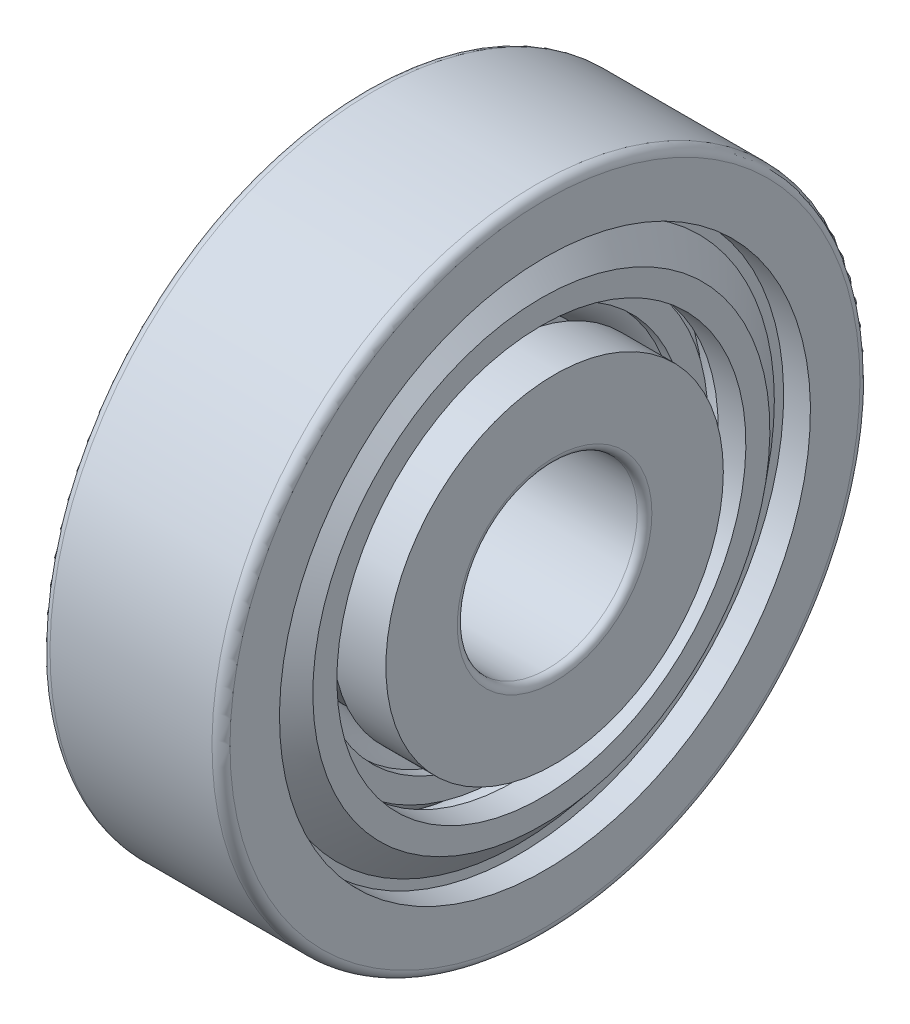
ISO-10303-21;
HEADER;
FILE_DESCRIPTION(('STEP AP214'),'2;1');
FILE_NAME('part.step','',(''),(''),'','','');
FILE_SCHEMA(('AUTOMOTIVE_DESIGN { 1 0 10303 214 1 1 1 1 }'));
ENDSEC;
DATA;
#1=APPLICATION_CONTEXT('core data for automotive mechanical design processes');
#2=APPLICATION_PROTOCOL_DEFINITION('international standard','automotive_design',2000,#1);
#3=PRODUCT_CONTEXT('',#1,'mechanical');
#4=PRODUCT('Part','Part','',(#3));
#5=PRODUCT_RELATED_PRODUCT_CATEGORY('part','',(#4));
#6=PRODUCT_DEFINITION_FORMATION('','',#4);
#7=PRODUCT_DEFINITION_CONTEXT('part definition',#1,'design');
#8=PRODUCT_DEFINITION('design','',#6,#7);
#9=PRODUCT_DEFINITION_SHAPE('','',#8);
#10=(LENGTH_UNIT() NAMED_UNIT(*) SI_UNIT(.MILLI.,.METRE.));
#11=(NAMED_UNIT(*) PLANE_ANGLE_UNIT() SI_UNIT($,.RADIAN.));
#12=(NAMED_UNIT(*) SI_UNIT($,.STERADIAN.) SOLID_ANGLE_UNIT());
#13=UNCERTAINTY_MEASURE_WITH_UNIT(LENGTH_MEASURE(1.E-05),#10,'distance_accuracy_value','');
#14=(GEOMETRIC_REPRESENTATION_CONTEXT(3) GLOBAL_UNCERTAINTY_ASSIGNED_CONTEXT((#13)) GLOBAL_UNIT_ASSIGNED_CONTEXT((#10,
#11,#12)) REPRESENTATION_CONTEXT('',''));
#15=CARTESIAN_POINT('',(0.,0.,0.));
#16=DIRECTION('',(0.,0.,1.));
#17=DIRECTION('',(1.,0.,0.));
#18=AXIS2_PLACEMENT_3D('',#15,#16,#17);
#19=CARTESIAN_POINT('',(0.,0.,0.));
#20=DIRECTION('',(1.,0.,0.));
#21=DIRECTION('',(0.,0.,-1.));
#22=AXIS2_PLACEMENT_3D('',#19,#20,#21);
#23=TOROIDAL_SURFACE('',#22,10.31875,1.984375);
#24=CARTESIAN_POINT('',(1.8929731022039,0.,0.));
#25=DIRECTION('',(1.,0.,0.));
#26=DIRECTION('',(0.,0.,-1.));
#27=AXIS2_PLACEMENT_3D('',#24,#25,#26);
#28=CIRCLE('',#27,9.72343749806714);
#29=CARTESIAN_POINT('',(1.8929731022039,0.,-9.72343749806714));
#30=VERTEX_POINT('',#29);
#31=EDGE_CURVE('E11',#30,#30,#28,.T.);
#32=ORIENTED_EDGE('',*,*,#31,.T.);
#33=EDGE_LOOP('',(#32));
#34=FACE_BOUND('',#33,.T.);
#35=CARTESIAN_POINT('',(-1.89297310341961,0.,0.));
#36=DIRECTION('',(1.,0.,0.));
#37=DIRECTION('',(0.,0.,-1.));
#38=AXIS2_PLACEMENT_3D('',#35,#36,#37);
#39=CIRCLE('',#38,9.72343750193286);
#40=CARTESIAN_POINT('',(-1.89297310341961,0.,-9.72343750193286));
#41=VERTEX_POINT('',#40);
#42=EDGE_CURVE('E70',#41,#41,#39,.T.);
#43=ORIENTED_EDGE('',*,*,#42,.F.);
#44=EDGE_LOOP('',(#43));
#45=FACE_BOUND('',#44,.T.);
#46=ADVANCED_FACE('F42',(#34,#45),#23,.T.);
#47=CARTESIAN_POINT('',(-2.48046875,0.,0.));
#48=DIRECTION('',(1.,0.,0.));
#49=DIRECTION('',(0.,0.,-1.));
#50=AXIS2_PLACEMENT_3D('',#47,#48,#49);
#51=CYLINDRICAL_SURFACE('',#50,9.72343750201236);
#52=CARTESIAN_POINT('',(2.48046874939214,0.,0.));
#53=DIRECTION('',(1.,0.,0.));
#54=DIRECTION('',(0.,0.,-1.));
#55=AXIS2_PLACEMENT_3D('',#52,#53,#54);
#56=CIRCLE('',#55,9.72343750595758);
#57=CARTESIAN_POINT('',(2.48046874939214,0.,-9.72343750595758));
#58=VERTEX_POINT('',#57);
#59=EDGE_CURVE('E48',#58,#58,#56,.T.);
#60=ORIENTED_EDGE('',*,*,#59,.T.);
#61=EDGE_LOOP('',(#60));
#62=FACE_BOUND('',#61,.T.);
#63=ORIENTED_EDGE('',*,*,#31,.F.);
#64=EDGE_LOOP('',(#63));
#65=FACE_BOUND('',#64,.T.);
#66=ADVANCED_FACE('F78',(#62,#65),#51,.F.);
#67=CARTESIAN_POINT('',(2.48046874939214,9.72343750595758,0.));
#68=DIRECTION('',(1.,0.,0.));
#69=DIRECTION('',(0.,0.,-1.));
#70=AXIS2_PLACEMENT_3D('',#67,#68,#69);
#71=PLANE('',#70);
#72=CARTESIAN_POINT('',(2.48046874939214,0.,0.));
#73=DIRECTION('',(1.,0.,0.));
#74=DIRECTION('',(0.,0.,-1.));
#75=AXIS2_PLACEMENT_3D('',#72,#73,#74);
#76=CIRCLE('',#75,10.9140625061487);
#77=CARTESIAN_POINT('',(2.48046874939214,0.,-10.9140625061487));
#78=VERTEX_POINT('',#77);
#79=EDGE_CURVE('E52',#78,#78,#76,.T.);
#80=ORIENTED_EDGE('',*,*,#79,.T.);
#81=EDGE_LOOP('',(#80));
#82=FACE_BOUND('',#81,.T.);
#83=ORIENTED_EDGE('',*,*,#59,.F.);
#84=EDGE_LOOP('',(#83));
#85=FACE_BOUND('',#84,.T.);
#86=ADVANCED_FACE('F82',(#82,#85),#71,.T.);
#87=CARTESIAN_POINT('',(-2.48046875,0.,0.));
#88=DIRECTION('',(1.,0.,0.));
#89=DIRECTION('',(0.,0.,-1.));
#90=AXIS2_PLACEMENT_3D('',#87,#88,#89);
#91=CYLINDRICAL_SURFACE('',#90,10.9140625051028);
#92=CARTESIAN_POINT('',(1.8929731022039,0.,0.));
#93=DIRECTION('',(1.,0.,0.));
#94=DIRECTION('',(0.,0.,-1.));
#95=AXIS2_PLACEMENT_3D('',#92,#93,#94);
#96=CIRCLE('',#95,10.9140625040569);
#97=CARTESIAN_POINT('',(1.8929731022039,0.,-10.9140625040569));
#98=VERTEX_POINT('',#97);
#99=EDGE_CURVE('E56',#98,#98,#96,.T.);
#100=ORIENTED_EDGE('',*,*,#99,.T.);
#101=EDGE_LOOP('',(#100));
#102=FACE_BOUND('',#101,.T.);
#103=ORIENTED_EDGE('',*,*,#79,.F.);
#104=EDGE_LOOP('',(#103));
#105=FACE_BOUND('',#104,.T.);
#106=ADVANCED_FACE('F86',(#102,#105),#91,.T.);
#107=CARTESIAN_POINT('',(0.,0.,0.));
#108=DIRECTION('',(1.,0.,0.));
#109=DIRECTION('',(0.,0.,-1.));
#110=AXIS2_PLACEMENT_3D('',#107,#108,#109);
#111=TOROIDAL_SURFACE('',#110,10.31875,1.98437500063721);
#112=CARTESIAN_POINT('',(-1.89297310341961,0.,0.));
#113=DIRECTION('',(1.,0.,0.));
#114=DIRECTION('',(0.,0.,-1.));
#115=AXIS2_PLACEMENT_3D('',#112,#113,#114);
#116=CIRCLE('',#115,10.9140625001912);
#117=CARTESIAN_POINT('',(-1.89297310341961,0.,-10.9140625001912));
#118=VERTEX_POINT('',#117);
#119=EDGE_CURVE('E61',#118,#118,#116,.T.);
#120=ORIENTED_EDGE('',*,*,#119,.T.);
#121=EDGE_LOOP('',(#120));
#122=FACE_BOUND('',#121,.T.);
#123=ORIENTED_EDGE('',*,*,#99,.F.);
#124=EDGE_LOOP('',(#123));
#125=FACE_BOUND('',#124,.T.);
#126=ADVANCED_FACE('F93',(#122,#125),#111,.T.);
#127=CARTESIAN_POINT('',(-2.48046875,0.,0.));
#128=DIRECTION('',(1.,0.,0.));
#129=DIRECTION('',(0.,0.,-1.));
#130=AXIS2_PLACEMENT_3D('',#127,#128,#129);
#131=CYLINDRICAL_SURFACE('',#130,10.9140625001912);
#132=CARTESIAN_POINT('',(-2.48046875060786,0.,0.));
#133=DIRECTION('',(1.,0.,0.));
#134=DIRECTION('',(0.,0.,-1.));
#135=AXIS2_PLACEMENT_3D('',#132,#133,#134);
#136=CIRCLE('',#135,10.9140625001912);
#137=CARTESIAN_POINT('',(-2.48046875060786,0.,-10.9140625001912));
#138=VERTEX_POINT('',#137);
#139=EDGE_CURVE('E64',#138,#138,#136,.T.);
#140=ORIENTED_EDGE('',*,*,#139,.T.);
#141=EDGE_LOOP('',(#140));
#142=FACE_BOUND('',#141,.T.);
#143=ORIENTED_EDGE('',*,*,#119,.F.);
#144=EDGE_LOOP('',(#143));
#145=FACE_BOUND('',#144,.T.);
#146=ADVANCED_FACE('F97',(#142,#145),#131,.T.);
#147=CARTESIAN_POINT('',(-2.48046875060786,10.9140625001912,0.));
#148=DIRECTION('',(-1.,0.,0.));
#149=DIRECTION('',(0.,0.,1.));
#150=AXIS2_PLACEMENT_3D('',#147,#148,#149);
#151=PLANE('',#150);
#152=CARTESIAN_POINT('',(-2.48046875060786,0.,0.));
#153=DIRECTION('',(1.,0.,0.));
#154=DIRECTION('',(0.,0.,-1.));
#155=AXIS2_PLACEMENT_3D('',#152,#153,#154);
#156=CIRCLE('',#155,9.7234375);
#157=CARTESIAN_POINT('',(-2.48046875060786,0.,-9.7234375));
#158=VERTEX_POINT('',#157);
#159=EDGE_CURVE('E67',#158,#158,#156,.T.);
#160=ORIENTED_EDGE('',*,*,#159,.T.);
#161=EDGE_LOOP('',(#160));
#162=FACE_BOUND('',#161,.T.);
#163=ORIENTED_EDGE('',*,*,#139,.F.);
#164=EDGE_LOOP('',(#163));
#165=FACE_BOUND('',#164,.T.);
#166=ADVANCED_FACE('F101',(#162,#165),#151,.T.);
#167=CARTESIAN_POINT('',(-2.48046875,0.,0.));
#168=DIRECTION('',(1.,0.,0.));
#169=DIRECTION('',(0.,0.,-1.));
#170=AXIS2_PLACEMENT_3D('',#167,#168,#169);
#171=CYLINDRICAL_SURFACE('',#170,9.72343750096643);
#172=ORIENTED_EDGE('',*,*,#42,.T.);
#173=EDGE_LOOP('',(#172));
#174=FACE_BOUND('',#173,.T.);
#175=ORIENTED_EDGE('',*,*,#159,.F.);
#176=EDGE_LOOP('',(#175));
#177=FACE_BOUND('',#176,.T.);
#178=ADVANCED_FACE('F74',(#174,#177),#171,.F.);
#179=CLOSED_SHELL('',(#46,#66,#86,#106,#126,#146,#166,#178));
#180=MANIFOLD_SOLID_BREP('B2',#179);
#181=CARTESIAN_POINT('',(0.508661040394074,0.,0.));
#182=DIRECTION('',(1.,0.,0.));
#183=DIRECTION('',(0.,0.,-1.));
#184=AXIS2_PLACEMENT_3D('',#181,#182,#183);
#185=TOROIDAL_SURFACE('',#184,10.3655627851351,2.402165314023);
#186=CARTESIAN_POINT('',(-1.41712720378895,0.,0.));
#187=DIRECTION('',(1.,0.,0.));
#188=DIRECTION('',(0.,0.,-1.));
#189=AXIS2_PLACEMENT_3D('',#186,#187,#188);
#190=CIRCLE('',#189,8.9296875);
#191=CARTESIAN_POINT('',(-1.41712720378895,0.,-8.9296875));
#192=VERTEX_POINT('',#191);
#193=EDGE_CURVE('E199',#192,#192,#190,.T.);
#194=ORIENTED_EDGE('',*,*,#193,.T.);
#195=EDGE_LOOP('',(#194));
#196=FACE_BOUND('',#195,.T.);
#197=CARTESIAN_POINT('',(2.43444928457709,0.,0.));
#198=DIRECTION('',(1.,0.,0.));
#199=DIRECTION('',(0.,0.,-1.));
#200=AXIS2_PLACEMENT_3D('',#197,#198,#199);
#201=CIRCLE('',#200,8.9296875);
#202=CARTESIAN_POINT('',(2.43444928457709,0.,-8.9296875));
#203=VERTEX_POINT('',#202);
#204=EDGE_CURVE('E41',#203,#203,#201,.T.);
#205=ORIENTED_EDGE('',*,*,#204,.F.);
#206=EDGE_LOOP('',(#205));
#207=FACE_BOUND('',#206,.T.);
#208=ADVANCED_FACE('F171',(#196,#207),#185,.F.);
#209=CARTESIAN_POINT('',(-3.96875,0.,0.));
#210=DIRECTION('',(1.,0.,0.));
#211=DIRECTION('',(0.,0.,-1.));
#212=AXIS2_PLACEMENT_3D('',#209,#210,#211);
#213=CYLINDRICAL_SURFACE('',#212,8.9296875);
#214=ORIENTED_EDGE('',*,*,#204,.T.);
#215=EDGE_LOOP('',(#214));
#216=FACE_BOUND('',#215,.T.);
#217=CARTESIAN_POINT('',(5.27116105629962,0.,0.));
#218=DIRECTION('',(1.,0.,0.));
#219=DIRECTION('',(0.,0.,-1.));
#220=AXIS2_PLACEMENT_3D('',#217,#218,#219);
#221=CIRCLE('',#220,8.9296875);
#222=CARTESIAN_POINT('',(5.27116105629962,0.,-8.9296875));
#223=VERTEX_POINT('',#222);
#224=EDGE_CURVE('E177',#223,#223,#221,.T.);
#225=ORIENTED_EDGE('',*,*,#224,.F.);
#226=EDGE_LOOP('',(#225));
#227=FACE_BOUND('',#226,.T.);
#228=ADVANCED_FACE('F217',(#216,#227),#213,.T.);
#229=CARTESIAN_POINT('',(5.27146997295227,0.,0.));
#230=DIRECTION('',(-1.,0.,0.));
#231=DIRECTION('',(0.,0.,1.));
#232=AXIS2_PLACEMENT_3D('',#229,#230,#231);
#233=CONICAL_SURFACE('',#232,5.14988165741046,1.57071459861498);
#234=ORIENTED_EDGE('',*,*,#224,.T.);
#235=EDGE_LOOP('',(#234));
#236=FACE_BOUND('',#235,.T.);
#237=CARTESIAN_POINT('',(5.27146997295227,0.,0.));
#238=DIRECTION('',(1.,0.,0.));
#239=DIRECTION('',(0.,0.,-1.));
#240=AXIS2_PLACEMENT_3D('',#237,#238,#239);
#241=CIRCLE('',#240,5.14988165741046);
#242=CARTESIAN_POINT('',(5.27146997295227,0.,-5.14988165741046));
#243=VERTEX_POINT('',#242);
#244=EDGE_CURVE('E181',#243,#243,#241,.T.);
#245=ORIENTED_EDGE('',*,*,#244,.F.);
#246=EDGE_LOOP('',(#245));
#247=FACE_BOUND('',#246,.T.);
#248=ADVANCED_FACE('F221',(#236,#247),#233,.T.);
#249=CARTESIAN_POINT('',(4.88411997424593,0.,0.));
#250=DIRECTION('',(1.,0.,0.));
#251=DIRECTION('',(0.,0.,-1.));
#252=AXIS2_PLACEMENT_3D('',#249,#250,#251);
#253=TOROIDAL_SURFACE('',#252,5.14985,0.38735);
#254=ORIENTED_EDGE('',*,*,#244,.T.);
#255=EDGE_LOOP('',(#254));
#256=FACE_BOUND('',#255,.T.);
#257=CARTESIAN_POINT('',(4.88411997424593,0.,0.));
#258=DIRECTION('',(1.,0.,0.));
#259=DIRECTION('',(0.,0.,-1.));
#260=AXIS2_PLACEMENT_3D('',#257,#258,#259);
#261=CIRCLE('',#260,4.7625);
#262=CARTESIAN_POINT('',(4.88411997424593,0.,-4.7625));
#263=VERTEX_POINT('',#262);
#264=EDGE_CURVE('E185',#263,#263,#261,.T.);
#265=ORIENTED_EDGE('',*,*,#264,.F.);
#266=EDGE_LOOP('',(#265));
#267=FACE_BOUND('',#266,.T.);
#268=ADVANCED_FACE('F225',(#256,#267),#253,.T.);
#269=CARTESIAN_POINT('',(-3.96875,0.,0.));
#270=DIRECTION('',(1.,0.,0.));
#271=DIRECTION('',(0.,0.,-1.));
#272=AXIS2_PLACEMENT_3D('',#269,#270,#271);
#273=CYLINDRICAL_SURFACE('',#272,4.7625);
#274=ORIENTED_EDGE('',*,*,#264,.T.);
#275=EDGE_LOOP('',(#274));
#276=FACE_BOUND('',#275,.T.);
#277=CARTESIAN_POINT('',(-3.85665583340697,0.,0.));
#278=DIRECTION('',(1.,0.,0.));
#279=DIRECTION('',(0.,0.,-1.));
#280=AXIS2_PLACEMENT_3D('',#277,#278,#279);
#281=CIRCLE('',#280,4.7625);
#282=CARTESIAN_POINT('',(-3.85665583340697,0.,-4.7625));
#283=VERTEX_POINT('',#282);
#284=EDGE_CURVE('E190',#283,#283,#281,.T.);
#285=ORIENTED_EDGE('',*,*,#284,.F.);
#286=EDGE_LOOP('',(#285));
#287=FACE_BOUND('',#286,.T.);
#288=ADVANCED_FACE('F231',(#276,#287),#273,.F.);
#289=CARTESIAN_POINT('',(-3.85665583340697,0.,0.));
#290=DIRECTION('',(1.,0.,0.));
#291=DIRECTION('',(0.,0.,-1.));
#292=AXIS2_PLACEMENT_3D('',#289,#290,#291);
#293=TOROIDAL_SURFACE('',#292,5.159375,0.396875);
#294=ORIENTED_EDGE('',*,*,#284,.T.);
#295=EDGE_LOOP('',(#294));
#296=FACE_BOUND('',#295,.T.);
#297=CARTESIAN_POINT('',(-4.25353083208151,0.,0.));
#298=DIRECTION('',(1.,0.,0.));
#299=DIRECTION('',(0.,0.,-1.));
#300=AXIS2_PLACEMENT_3D('',#297,#298,#299);
#301=CIRCLE('',#300,5.15934256412863);
#302=CARTESIAN_POINT('',(-4.25353083208151,0.,-5.15934256412863));
#303=VERTEX_POINT('',#302);
#304=EDGE_CURVE('E193',#303,#303,#301,.T.);
#305=ORIENTED_EDGE('',*,*,#304,.F.);
#306=EDGE_LOOP('',(#305));
#307=FACE_BOUND('',#306,.T.);
#308=ADVANCED_FACE('F213',(#296,#307),#293,.T.);
#309=CARTESIAN_POINT('',(-4.25383897551148,0.,0.));
#310=DIRECTION('',(-1.,0.,0.));
#311=DIRECTION('',(0.,0.,1.));
#312=AXIS2_PLACEMENT_3D('',#309,#310,#311);
#313=CONICAL_SURFACE('',#312,8.9296875,1.57071459861498);
#314=ORIENTED_EDGE('',*,*,#304,.T.);
#315=EDGE_LOOP('',(#314));
#316=FACE_BOUND('',#315,.T.);
#317=CARTESIAN_POINT('',(-4.25383897551148,0.,0.));
#318=DIRECTION('',(1.,0.,0.));
#319=DIRECTION('',(0.,0.,-1.));
#320=AXIS2_PLACEMENT_3D('',#317,#318,#319);
#321=CIRCLE('',#320,8.9296875);
#322=CARTESIAN_POINT('',(-4.25383897551148,0.,-8.9296875));
#323=VERTEX_POINT('',#322);
#324=EDGE_CURVE('E196',#323,#323,#321,.T.);
#325=ORIENTED_EDGE('',*,*,#324,.F.);
#326=EDGE_LOOP('',(#325));
#327=FACE_BOUND('',#326,.T.);
#328=ADVANCED_FACE('F207',(#316,#327),#313,.F.);
#329=CARTESIAN_POINT('',(-3.96875,0.,0.));
#330=DIRECTION('',(1.,0.,0.));
#331=DIRECTION('',(0.,0.,-1.));
#332=AXIS2_PLACEMENT_3D('',#329,#330,#331);
#333=CYLINDRICAL_SURFACE('',#332,8.9296875);
#334=ORIENTED_EDGE('',*,*,#324,.T.);
#335=EDGE_LOOP('',(#334));
#336=FACE_BOUND('',#335,.T.);
#337=ORIENTED_EDGE('',*,*,#193,.F.);
#338=EDGE_LOOP('',(#337));
#339=FACE_BOUND('',#338,.T.);
#340=ADVANCED_FACE('F205',(#336,#339),#333,.T.);
#341=CLOSED_SHELL('',(#208,#228,#248,#268,#288,#308,#328,#340));
#342=MANIFOLD_SOLID_BREP('B6',#341);
#343=CARTESIAN_POINT('',(0.,0.,0.));
#344=DIRECTION('',(1.,0.,0.));
#345=DIRECTION('',(0.,1.,0.));
#346=AXIS2_PLACEMENT_3D('',#343,#344,#345);
#347=TOROIDAL_SURFACE('',#346,12.3825,2.38124999999999);
#348=CARTESIAN_POINT('',(1.70055264454674,0.,0.));
#349=DIRECTION('',(1.,0.,0.));
#350=DIRECTION('',(0.,1.,0.));
#351=AXIS2_PLACEMENT_3D('',#348,#349,#350);
#352=CIRCLE('',#351,14.049375);
#353=CARTESIAN_POINT('',(1.70055264454674,14.049375,0.));
#354=VERTEX_POINT('',#353);
#355=EDGE_CURVE('E357',#354,#354,#352,.T.);
#356=ORIENTED_EDGE('',*,*,#355,.T.);
#357=EDGE_LOOP('',(#356));
#358=FACE_BOUND('',#357,.T.);
#359=CARTESIAN_POINT('',(-1.70055264454674,0.,0.));
#360=DIRECTION('',(1.,0.,0.));
#361=DIRECTION('',(0.,1.,0.));
#362=AXIS2_PLACEMENT_3D('',#359,#360,#361);
#363=CIRCLE('',#362,14.049375);
#364=CARTESIAN_POINT('',(-1.70055264454674,14.049375,0.));
#365=VERTEX_POINT('',#364);
#366=EDGE_CURVE('E170',#365,#365,#363,.T.);
#367=ORIENTED_EDGE('',*,*,#366,.F.);
#368=EDGE_LOOP('',(#367));
#369=FACE_BOUND('',#368,.T.);
#370=ADVANCED_FACE('F293',(#358,#369),#347,.F.);
#371=CARTESIAN_POINT('',(-4.7625,0.,0.));
#372=DIRECTION('',(1.,0.,0.));
#373=DIRECTION('',(0.,1.,0.));
#374=AXIS2_PLACEMENT_3D('',#371,#372,#373);
#375=CYLINDRICAL_SURFACE('',#374,14.049375);
#376=ORIENTED_EDGE('',*,*,#366,.T.);
#377=EDGE_LOOP('',(#376));
#378=FACE_BOUND('',#377,.T.);
#379=CARTESIAN_POINT('',(-3.10524361881795,0.,0.));
#380=DIRECTION('',(1.,0.,0.));
#381=DIRECTION('',(0.,1.,0.));
#382=AXIS2_PLACEMENT_3D('',#379,#380,#381);
#383=CIRCLE('',#382,14.049375);
#384=CARTESIAN_POINT('',(-3.10524361881795,14.049375,0.));
#385=VERTEX_POINT('',#384);
#386=EDGE_CURVE('E299',#385,#385,#383,.T.);
#387=ORIENTED_EDGE('',*,*,#386,.F.);
#388=EDGE_LOOP('',(#387));
#389=FACE_BOUND('',#388,.T.);
#390=ADVANCED_FACE('F375',(#378,#389),#375,.F.);
#391=CARTESIAN_POINT('',(-3.10524361881795,10.82278125,0.));
#392=DIRECTION('',(1.,0.,0.));
#393=DIRECTION('',(0.,1.,0.));
#394=AXIS2_PLACEMENT_3D('',#391,#392,#393);
#395=PLANE('',#394);
#396=ORIENTED_EDGE('',*,*,#386,.T.);
#397=EDGE_LOOP('',(#396));
#398=FACE_BOUND('',#397,.T.);
#399=CARTESIAN_POINT('',(-3.10524361881795,0.,0.));
#400=DIRECTION('',(1.,0.,0.));
#401=DIRECTION('',(0.,1.,0.));
#402=AXIS2_PLACEMENT_3D('',#399,#400,#401);
#403=CIRCLE('',#402,10.82278125);
#404=CARTESIAN_POINT('',(-3.10524361881795,10.82278125,0.));
#405=VERTEX_POINT('',#404);
#406=EDGE_CURVE('E303',#405,#405,#403,.T.);
#407=ORIENTED_EDGE('',*,*,#406,.F.);
#408=EDGE_LOOP('',(#407));
#409=FACE_BOUND('',#408,.T.);
#410=ADVANCED_FACE('F379',(#398,#409),#395,.T.);
#411=CARTESIAN_POINT('',(-4.7625,0.,0.));
#412=DIRECTION('',(1.,0.,0.));
#413=DIRECTION('',(0.,1.,0.));
#414=AXIS2_PLACEMENT_3D('',#411,#412,#413);
#415=CYLINDRICAL_SURFACE('',#414,10.82278125);
#416=ORIENTED_EDGE('',*,*,#406,.T.);
#417=EDGE_LOOP('',(#416));
#418=FACE_BOUND('',#417,.T.);
#419=CARTESIAN_POINT('',(-4.57200000000087,0.,0.));
#420=DIRECTION('',(1.,0.,0.));
#421=DIRECTION('',(0.,1.,0.));
#422=AXIS2_PLACEMENT_3D('',#419,#420,#421);
#423=CIRCLE('',#422,10.82278125);
#424=CARTESIAN_POINT('',(-4.57200000000087,10.82278125,0.));
#425=VERTEX_POINT('',#424);
#426=EDGE_CURVE('E307',#425,#425,#423,.T.);
#427=ORIENTED_EDGE('',*,*,#426,.F.);
#428=EDGE_LOOP('',(#427));
#429=FACE_BOUND('',#428,.T.);
#430=ADVANCED_FACE('F383',(#418,#429),#415,.F.);
#431=CARTESIAN_POINT('',(-4.57200000000087,12.0934210124996,0.));
#432=DIRECTION('',(-1.,0.,0.));
#433=DIRECTION('',(0.,-1.,0.));
#434=AXIS2_PLACEMENT_3D('',#431,#432,#433);
#435=PLANE('',#434);
#436=ORIENTED_EDGE('',*,*,#426,.T.);
#437=EDGE_LOOP('',(#436));
#438=FACE_BOUND('',#437,.T.);
#439=CARTESIAN_POINT('',(-4.57200000000087,0.,0.));
#440=DIRECTION('',(1.,0.,0.));
#441=DIRECTION('',(0.,1.,0.));
#442=AXIS2_PLACEMENT_3D('',#439,#440,#441);
#443=CIRCLE('',#442,12.0934210124996);
#444=CARTESIAN_POINT('',(-4.57200000000087,12.0934210124996,0.));
#445=VERTEX_POINT('',#444);
#446=EDGE_CURVE('E312',#445,#445,#443,.T.);
#447=ORIENTED_EDGE('',*,*,#446,.F.);
#448=EDGE_LOOP('',(#447));
#449=FACE_BOUND('',#448,.T.);
#450=ADVANCED_FACE('F389',(#438,#449),#435,.T.);
#451=CARTESIAN_POINT('',(-3.34336861881708,0.,0.));
#452=DIRECTION('',(1.,0.,0.));
#453=DIRECTION('',(0.,1.,0.));
#454=AXIS2_PLACEMENT_3D('',#451,#452,#453);
#455=CONICAL_SURFACE('',#454,13.5576468749989,0.872664625997);
#456=ORIENTED_EDGE('',*,*,#446,.T.);
#457=EDGE_LOOP('',(#456));
#458=FACE_BOUND('',#457,.T.);
#459=CARTESIAN_POINT('',(-3.34336861881708,0.,0.));
#460=DIRECTION('',(1.,0.,0.));
#461=DIRECTION('',(0.,1.,0.));
#462=AXIS2_PLACEMENT_3D('',#459,#460,#461);
#463=CIRCLE('',#462,13.5576468749989);
#464=CARTESIAN_POINT('',(-3.34336861881708,13.5576468749989,0.));
#465=VERTEX_POINT('',#464);
#466=EDGE_CURVE('E315',#465,#465,#463,.T.);
#467=ORIENTED_EDGE('',*,*,#466,.F.);
#468=EDGE_LOOP('',(#467));
#469=FACE_BOUND('',#468,.T.);
#470=ADVANCED_FACE('F393',(#458,#469),#455,.T.);
#471=CARTESIAN_POINT('',(-3.34336861881708,14.049375,0.));
#472=DIRECTION('',(-1.,0.,0.));
#473=DIRECTION('',(0.,-1.,0.));
#474=AXIS2_PLACEMENT_3D('',#471,#472,#473);
#475=PLANE('',#474);
#476=ORIENTED_EDGE('',*,*,#466,.T.);
#477=EDGE_LOOP('',(#476));
#478=FACE_BOUND('',#477,.T.);
#479=CARTESIAN_POINT('',(-3.34336861881708,0.,0.));
#480=DIRECTION('',(1.,0.,0.));
#481=DIRECTION('',(0.,1.,0.));
#482=AXIS2_PLACEMENT_3D('',#479,#480,#481);
#483=CIRCLE('',#482,14.049375);
#484=CARTESIAN_POINT('',(-3.34336861881708,14.049375,0.));
#485=VERTEX_POINT('',#484);
#486=EDGE_CURVE('E318',#485,#485,#483,.T.);
#487=ORIENTED_EDGE('',*,*,#486,.F.);
#488=EDGE_LOOP('',(#487));
#489=FACE_BOUND('',#488,.T.);
#490=ADVANCED_FACE('F397',(#478,#489),#475,.T.);
#491=CARTESIAN_POINT('',(-4.7625,0.,0.));
#492=DIRECTION('',(1.,0.,0.));
#493=DIRECTION('',(0.,1.,0.));
#494=AXIS2_PLACEMENT_3D('',#491,#492,#493);
#495=CYLINDRICAL_SURFACE('',#494,14.049375);
#496=ORIENTED_EDGE('',*,*,#486,.T.);
#497=EDGE_LOOP('',(#496));
#498=FACE_BOUND('',#497,.T.);
#499=CARTESIAN_POINT('',(-4.7625,0.,0.));
#500=DIRECTION('',(1.,0.,0.));
#501=DIRECTION('',(0.,1.,0.));
#502=AXIS2_PLACEMENT_3D('',#499,#500,#501);
#503=CIRCLE('',#502,14.049375);
#504=CARTESIAN_POINT('',(-4.7625,14.049375,0.));
#505=VERTEX_POINT('',#504);
#506=EDGE_CURVE('E321',#505,#505,#503,.T.);
#507=ORIENTED_EDGE('',*,*,#506,.F.);
#508=EDGE_LOOP('',(#507));
#509=FACE_BOUND('',#508,.T.);
#510=ADVANCED_FACE('F401',(#498,#509),#495,.F.);
#511=CARTESIAN_POINT('',(-4.7625,16.66875,0.));
#512=DIRECTION('',(-1.,0.,0.));
#513=DIRECTION('',(0.,-1.,0.));
#514=AXIS2_PLACEMENT_3D('',#511,#512,#513);
#515=PLANE('',#514);
#516=ORIENTED_EDGE('',*,*,#506,.T.);
#517=EDGE_LOOP('',(#516));
#518=FACE_BOUND('',#517,.T.);
#519=CARTESIAN_POINT('',(-4.7625,0.,0.));
#520=DIRECTION('',(1.,0.,0.));
#521=DIRECTION('',(0.,1.,0.));
#522=AXIS2_PLACEMENT_3D('',#519,#520,#521);
#523=CIRCLE('',#522,16.66875);
#524=CARTESIAN_POINT('',(-4.7625,16.66875,0.));
#525=VERTEX_POINT('',#524);
#526=EDGE_CURVE('E324',#525,#525,#523,.T.);
#527=ORIENTED_EDGE('',*,*,#526,.F.);
#528=EDGE_LOOP('',(#527));
#529=FACE_BOUND('',#528,.T.);
#530=ADVANCED_FACE('F405',(#518,#529),#515,.T.);
#531=CARTESIAN_POINT('',(-4.28625,0.,0.));
#532=DIRECTION('',(1.,0.,0.));
#533=DIRECTION('',(0.,1.,0.));
#534=AXIS2_PLACEMENT_3D('',#531,#532,#533);
#535=TOROIDAL_SURFACE('',#534,16.66875,0.476249999999998);
#536=ORIENTED_EDGE('',*,*,#526,.T.);
#537=EDGE_LOOP('',(#536));
#538=FACE_BOUND('',#537,.T.);
#539=CARTESIAN_POINT('',(-4.28625,0.,0.));
#540=DIRECTION('',(1.,0.,0.));
#541=DIRECTION('',(0.,1.,0.));
#542=AXIS2_PLACEMENT_3D('',#539,#540,#541);
#543=CIRCLE('',#542,17.145);
#544=CARTESIAN_POINT('',(-4.28625,17.145,0.));
#545=VERTEX_POINT('',#544);
#546=EDGE_CURVE('E327',#545,#545,#543,.T.);
#547=ORIENTED_EDGE('',*,*,#546,.F.);
#548=EDGE_LOOP('',(#547));
#549=FACE_BOUND('',#548,.T.);
#550=ADVANCED_FACE('F409',(#538,#549),#535,.T.);
#551=CARTESIAN_POINT('',(-4.7625,0.,0.));
#552=DIRECTION('',(1.,0.,0.));
#553=DIRECTION('',(0.,1.,0.));
#554=AXIS2_PLACEMENT_3D('',#551,#552,#553);
#555=CYLINDRICAL_SURFACE('',#554,17.145);
#556=ORIENTED_EDGE('',*,*,#546,.T.);
#557=EDGE_LOOP('',(#556));
#558=FACE_BOUND('',#557,.T.);
#559=CARTESIAN_POINT('',(4.28625,0.,0.));
#560=DIRECTION('',(1.,0.,0.));
#561=DIRECTION('',(0.,1.,0.));
#562=AXIS2_PLACEMENT_3D('',#559,#560,#561);
#563=CIRCLE('',#562,17.145);
#564=CARTESIAN_POINT('',(4.28625,17.145,0.));
#565=VERTEX_POINT('',#564);
#566=EDGE_CURVE('E330',#565,#565,#563,.T.);
#567=ORIENTED_EDGE('',*,*,#566,.F.);
#568=EDGE_LOOP('',(#567));
#569=FACE_BOUND('',#568,.T.);
#570=ADVANCED_FACE('F413',(#558,#569),#555,.T.);
#571=CARTESIAN_POINT('',(4.28625,0.,0.));
#572=DIRECTION('',(1.,0.,0.));
#573=DIRECTION('',(0.,1.,0.));
#574=AXIS2_PLACEMENT_3D('',#571,#572,#573);
#575=TOROIDAL_SURFACE('',#574,16.66875,0.476250000000001);
#576=ORIENTED_EDGE('',*,*,#566,.T.);
#577=EDGE_LOOP('',(#576));
#578=FACE_BOUND('',#577,.T.);
#579=CARTESIAN_POINT('',(4.7625,0.,0.));
#580=DIRECTION('',(1.,0.,0.));
#581=DIRECTION('',(0.,1.,0.));
#582=AXIS2_PLACEMENT_3D('',#579,#580,#581);
#583=CIRCLE('',#582,16.66875);
#584=CARTESIAN_POINT('',(4.7625,16.66875,0.));
#585=VERTEX_POINT('',#584);
#586=EDGE_CURVE('E333',#585,#585,#583,.T.);
#587=ORIENTED_EDGE('',*,*,#586,.F.);
#588=EDGE_LOOP('',(#587));
#589=FACE_BOUND('',#588,.T.);
#590=ADVANCED_FACE('F417',(#578,#589),#575,.T.);
#591=CARTESIAN_POINT('',(4.7625,14.049375,0.));
#592=DIRECTION('',(1.,0.,0.));
#593=DIRECTION('',(0.,1.,0.));
#594=AXIS2_PLACEMENT_3D('',#591,#592,#593);
#595=PLANE('',#594);
#596=ORIENTED_EDGE('',*,*,#586,.T.);
#597=EDGE_LOOP('',(#596));
#598=FACE_BOUND('',#597,.T.);
#599=CARTESIAN_POINT('',(4.7625,0.,0.));
#600=DIRECTION('',(1.,0.,0.));
#601=DIRECTION('',(0.,1.,0.));
#602=AXIS2_PLACEMENT_3D('',#599,#600,#601);
#603=CIRCLE('',#602,14.049375);
#604=CARTESIAN_POINT('',(4.7625,14.049375,0.));
#605=VERTEX_POINT('',#604);
#606=EDGE_CURVE('E336',#605,#605,#603,.T.);
#607=ORIENTED_EDGE('',*,*,#606,.F.);
#608=EDGE_LOOP('',(#607));
#609=FACE_BOUND('',#608,.T.);
#610=ADVANCED_FACE('F421',(#598,#609),#595,.T.);
#611=CARTESIAN_POINT('',(-4.7625,0.,0.));
#612=DIRECTION('',(1.,0.,0.));
#613=DIRECTION('',(0.,1.,0.));
#614=AXIS2_PLACEMENT_3D('',#611,#612,#613);
#615=CYLINDRICAL_SURFACE('',#614,14.049375);
#616=ORIENTED_EDGE('',*,*,#606,.T.);
#617=EDGE_LOOP('',(#616));
#618=FACE_BOUND('',#617,.T.);
#619=CARTESIAN_POINT('',(3.34336861881708,0.,0.));
#620=DIRECTION('',(1.,0.,0.));
#621=DIRECTION('',(0.,1.,0.));
#622=AXIS2_PLACEMENT_3D('',#619,#620,#621);
#623=CIRCLE('',#622,14.049375);
#624=CARTESIAN_POINT('',(3.34336861881708,14.049375,0.));
#625=VERTEX_POINT('',#624);
#626=EDGE_CURVE('E339',#625,#625,#623,.T.);
#627=ORIENTED_EDGE('',*,*,#626,.F.);
#628=EDGE_LOOP('',(#627));
#629=FACE_BOUND('',#628,.T.);
#630=ADVANCED_FACE('F425',(#618,#629),#615,.F.);
#631=CARTESIAN_POINT('',(3.34336861881708,13.5576468749989,0.));
#632=DIRECTION('',(1.,0.,0.));
#633=DIRECTION('',(0.,1.,0.));
#634=AXIS2_PLACEMENT_3D('',#631,#632,#633);
#635=PLANE('',#634);
#636=ORIENTED_EDGE('',*,*,#626,.T.);
#637=EDGE_LOOP('',(#636));
#638=FACE_BOUND('',#637,.T.);
#639=CARTESIAN_POINT('',(3.34336861881708,0.,0.));
#640=DIRECTION('',(1.,0.,0.));
#641=DIRECTION('',(0.,1.,0.));
#642=AXIS2_PLACEMENT_3D('',#639,#640,#641);
#643=CIRCLE('',#642,13.5576468749989);
#644=CARTESIAN_POINT('',(3.34336861881708,13.5576468749989,0.));
#645=VERTEX_POINT('',#644);
#646=EDGE_CURVE('E342',#645,#645,#643,.T.);
#647=ORIENTED_EDGE('',*,*,#646,.F.);
#648=EDGE_LOOP('',(#647));
#649=FACE_BOUND('',#648,.T.);
#650=ADVANCED_FACE('F429',(#638,#649),#635,.T.);
#651=CARTESIAN_POINT('',(4.57200000000087,0.,0.));
#652=DIRECTION('',(-1.,0.,0.));
#653=DIRECTION('',(0.,-1.,0.));
#654=AXIS2_PLACEMENT_3D('',#651,#652,#653);
#655=CONICAL_SURFACE('',#654,12.0934210124996,0.872664625997);
#656=ORIENTED_EDGE('',*,*,#646,.T.);
#657=EDGE_LOOP('',(#656));
#658=FACE_BOUND('',#657,.T.);
#659=CARTESIAN_POINT('',(4.57200000000087,0.,0.));
#660=DIRECTION('',(1.,0.,0.));
#661=DIRECTION('',(0.,1.,0.));
#662=AXIS2_PLACEMENT_3D('',#659,#660,#661);
#663=CIRCLE('',#662,12.0934210124996);
#664=CARTESIAN_POINT('',(4.57200000000087,12.0934210124996,0.));
#665=VERTEX_POINT('',#664);
#666=EDGE_CURVE('E345',#665,#665,#663,.T.);
#667=ORIENTED_EDGE('',*,*,#666,.F.);
#668=EDGE_LOOP('',(#667));
#669=FACE_BOUND('',#668,.T.);
#670=ADVANCED_FACE('F433',(#658,#669),#655,.T.);
#671=CARTESIAN_POINT('',(4.57200000000087,10.82278125,0.));
#672=DIRECTION('',(1.,0.,0.));
#673=DIRECTION('',(0.,1.,0.));
#674=AXIS2_PLACEMENT_3D('',#671,#672,#673);
#675=PLANE('',#674);
#676=ORIENTED_EDGE('',*,*,#666,.T.);
#677=EDGE_LOOP('',(#676));
#678=FACE_BOUND('',#677,.T.);
#679=CARTESIAN_POINT('',(4.57200000000087,0.,0.));
#680=DIRECTION('',(1.,0.,0.));
#681=DIRECTION('',(0.,1.,0.));
#682=AXIS2_PLACEMENT_3D('',#679,#680,#681);
#683=CIRCLE('',#682,10.82278125);
#684=CARTESIAN_POINT('',(4.57200000000087,10.82278125,0.));
#685=VERTEX_POINT('',#684);
#686=EDGE_CURVE('E348',#685,#685,#683,.T.);
#687=ORIENTED_EDGE('',*,*,#686,.F.);
#688=EDGE_LOOP('',(#687));
#689=FACE_BOUND('',#688,.T.);
#690=ADVANCED_FACE('F437',(#678,#689),#675,.T.);
#691=CARTESIAN_POINT('',(-4.7625,0.,0.));
#692=DIRECTION('',(1.,0.,0.));
#693=DIRECTION('',(0.,1.,0.));
#694=AXIS2_PLACEMENT_3D('',#691,#692,#693);
#695=CYLINDRICAL_SURFACE('',#694,10.82278125);
#696=ORIENTED_EDGE('',*,*,#686,.T.);
#697=EDGE_LOOP('',(#696));
#698=FACE_BOUND('',#697,.T.);
#699=CARTESIAN_POINT('',(3.10524361881621,0.,0.));
#700=DIRECTION('',(1.,0.,0.));
#701=DIRECTION('',(0.,1.,0.));
#702=AXIS2_PLACEMENT_3D('',#699,#700,#701);
#703=CIRCLE('',#702,10.82278125);
#704=CARTESIAN_POINT('',(3.10524361881621,10.82278125,0.));
#705=VERTEX_POINT('',#704);
#706=EDGE_CURVE('E351',#705,#705,#703,.T.);
#707=ORIENTED_EDGE('',*,*,#706,.F.);
#708=EDGE_LOOP('',(#707));
#709=FACE_BOUND('',#708,.T.);
#710=ADVANCED_FACE('F371',(#698,#709),#695,.F.);
#711=CARTESIAN_POINT('',(3.10524361881621,14.049375,0.));
#712=DIRECTION('',(-1.,0.,0.));
#713=DIRECTION('',(0.,-1.,0.));
#714=AXIS2_PLACEMENT_3D('',#711,#712,#713);
#715=PLANE('',#714);
#716=ORIENTED_EDGE('',*,*,#706,.T.);
#717=EDGE_LOOP('',(#716));
#718=FACE_BOUND('',#717,.T.);
#719=CARTESIAN_POINT('',(3.10524361881621,0.,0.));
#720=DIRECTION('',(1.,0.,0.));
#721=DIRECTION('',(0.,1.,0.));
#722=AXIS2_PLACEMENT_3D('',#719,#720,#721);
#723=CIRCLE('',#722,14.049375);
#724=CARTESIAN_POINT('',(3.10524361881621,14.049375,0.));
#725=VERTEX_POINT('',#724);
#726=EDGE_CURVE('E354',#725,#725,#723,.T.);
#727=ORIENTED_EDGE('',*,*,#726,.F.);
#728=EDGE_LOOP('',(#727));
#729=FACE_BOUND('',#728,.T.);
#730=ADVANCED_FACE('F365',(#718,#729),#715,.T.);
#731=CARTESIAN_POINT('',(-4.7625,0.,0.));
#732=DIRECTION('',(1.,0.,0.));
#733=DIRECTION('',(0.,1.,0.));
#734=AXIS2_PLACEMENT_3D('',#731,#732,#733);
#735=CYLINDRICAL_SURFACE('',#734,14.049375);
#736=ORIENTED_EDGE('',*,*,#726,.T.);
#737=EDGE_LOOP('',(#736));
#738=FACE_BOUND('',#737,.T.);
#739=ORIENTED_EDGE('',*,*,#355,.F.);
#740=EDGE_LOOP('',(#739));
#741=FACE_BOUND('',#740,.T.);
#742=ADVANCED_FACE('F363',(#738,#741),#735,.F.);
#743=CLOSED_SHELL('',(#370,#390,#410,#430,#450,#470,#490,#510,#530,#550,#570,#590,#610,#630,
#650,#670,#690,#710,#730,#742));
#744=MANIFOLD_SOLID_BREP('B36',#743);
#745=ADVANCED_BREP_SHAPE_REPRESENTATION('',(#18,#180,#342,#744),#14);
#746=SHAPE_DEFINITION_REPRESENTATION(#9,#745);
ENDSEC;
END-ISO-10303-21;
